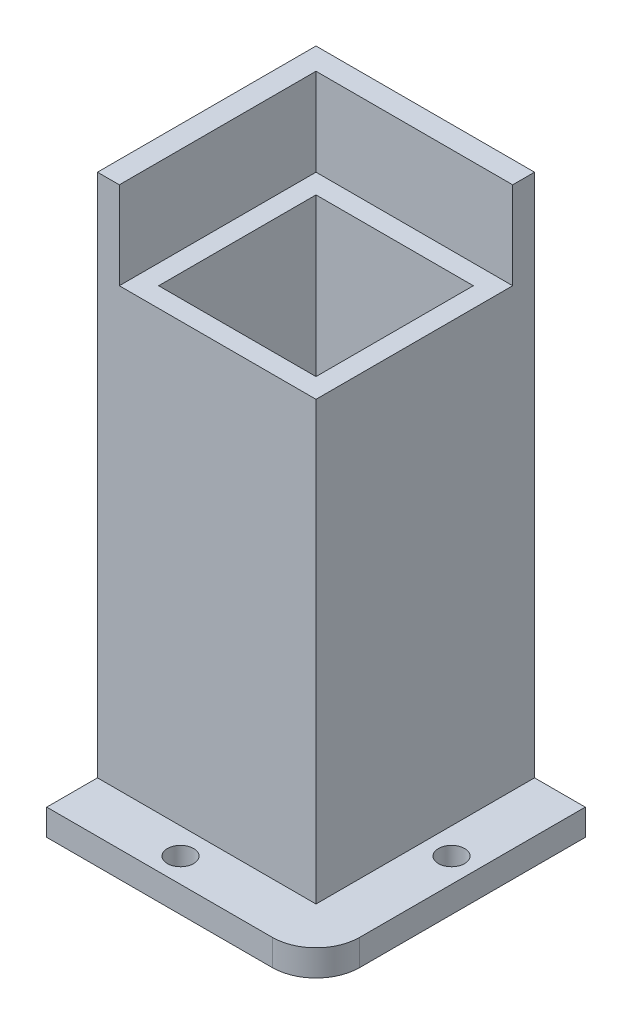
ISO-10303-21;
HEADER;
FILE_DESCRIPTION(('STEP AP214'),'2;1');
FILE_NAME('part.step','',(''),(''),'','','');
FILE_SCHEMA(('AUTOMOTIVE_DESIGN { 1 0 10303 214 1 1 1 1 }'));
ENDSEC;
DATA;
#1=APPLICATION_CONTEXT('core data for automotive mechanical design processes');
#2=APPLICATION_PROTOCOL_DEFINITION('international standard','automotive_design',2000,#1);
#3=PRODUCT_CONTEXT('',#1,'mechanical');
#4=PRODUCT('Part','Part','',(#3));
#5=PRODUCT_RELATED_PRODUCT_CATEGORY('part','',(#4));
#6=PRODUCT_DEFINITION_FORMATION('','',#4);
#7=PRODUCT_DEFINITION_CONTEXT('part definition',#1,'design');
#8=PRODUCT_DEFINITION('design','',#6,#7);
#9=PRODUCT_DEFINITION_SHAPE('','',#8);
#10=(LENGTH_UNIT() NAMED_UNIT(*) SI_UNIT(.MILLI.,.METRE.));
#11=(NAMED_UNIT(*) PLANE_ANGLE_UNIT() SI_UNIT($,.RADIAN.));
#12=(NAMED_UNIT(*) SI_UNIT($,.STERADIAN.) SOLID_ANGLE_UNIT());
#13=UNCERTAINTY_MEASURE_WITH_UNIT(LENGTH_MEASURE(1.E-05),#10,'distance_accuracy_value','');
#14=(GEOMETRIC_REPRESENTATION_CONTEXT(3) GLOBAL_UNCERTAINTY_ASSIGNED_CONTEXT((#13)) GLOBAL_UNIT_ASSIGNED_CONTEXT((#10,
#11,#12)) REPRESENTATION_CONTEXT('',''));
#15=CARTESIAN_POINT('',(0.,0.,0.));
#16=DIRECTION('',(0.,0.,1.));
#17=DIRECTION('',(1.,0.,0.));
#18=AXIS2_PLACEMENT_3D('',#15,#16,#17);
#19=CARTESIAN_POINT('',(12.5,63.,-12.5));
#20=DIRECTION('',(-1.,0.,0.));
#21=DIRECTION('',(0.,0.,1.));
#22=AXIS2_PLACEMENT_3D('',#19,#20,#21);
#23=PLANE('',#22);
#24=DIRECTION('',(0.,0.,1.));
#25=VECTOR('',#24,1.);
#26=CARTESIAN_POINT('',(12.5,3.,0.));
#27=LINE('',#26,#25);
#28=CARTESIAN_POINT('',(12.5,3.,-12.5));
#29=VERTEX_POINT('',#28);
#30=CARTESIAN_POINT('',(12.5,3.,12.5));
#31=VERTEX_POINT('',#30);
#32=EDGE_CURVE('E60',#29,#31,#27,.T.);
#33=ORIENTED_EDGE('',*,*,#32,.F.);
#34=DIRECTION('',(0.,-1.,0.));
#35=VECTOR('',#34,1.);
#36=CARTESIAN_POINT('',(12.5,63.,-12.5));
#37=LINE('',#36,#35);
#38=CARTESIAN_POINT('',(12.5,63.,-12.5));
#39=VERTEX_POINT('',#38);
#40=EDGE_CURVE('E11',#39,#29,#37,.T.);
#41=ORIENTED_EDGE('',*,*,#40,.F.);
#42=DIRECTION('',(0.,0.,-1.));
#43=VECTOR('',#42,1.);
#44=CARTESIAN_POINT('',(12.5,63.,-12.5));
#45=LINE('',#44,#43);
#46=CARTESIAN_POINT('',(12.5,63.,-9.99999999999998));
#47=VERTEX_POINT('',#46);
#48=EDGE_CURVE('E254',#47,#39,#45,.T.);
#49=ORIENTED_EDGE('',*,*,#48,.F.);
#50=DIRECTION('',(0.,1.,0.));
#51=VECTOR('',#50,1.);
#52=CARTESIAN_POINT('',(12.5,53.,-9.99999999999998));
#53=LINE('',#52,#51);
#54=CARTESIAN_POINT('',(12.5,53.,-9.99999999999998));
#55=VERTEX_POINT('',#54);
#56=EDGE_CURVE('E243',#55,#47,#53,.T.);
#57=ORIENTED_EDGE('',*,*,#56,.F.);
#58=DIRECTION('',(0.,0.,-1.));
#59=VECTOR('',#58,1.);
#60=CARTESIAN_POINT('',(12.5,53.,12.5));
#61=LINE('',#60,#59);
#62=CARTESIAN_POINT('',(12.5,53.,12.5));
#63=VERTEX_POINT('',#62);
#64=EDGE_CURVE('E231',#63,#55,#61,.T.);
#65=ORIENTED_EDGE('',*,*,#64,.F.);
#66=DIRECTION('',(0.,-1.,0.));
#67=VECTOR('',#66,1.);
#68=CARTESIAN_POINT('',(12.5,63.,12.5));
#69=LINE('',#68,#67);
#70=EDGE_CURVE('E264',#63,#31,#69,.T.);
#71=ORIENTED_EDGE('',*,*,#70,.T.);
#72=EDGE_LOOP('',(#33,#41,#49,#57,#65,#71));
#73=FACE_BOUND('',#72,.T.);
#74=ADVANCED_FACE('F38',(#73),#23,.F.);
#75=CARTESIAN_POINT('',(-12.5,63.,12.5));
#76=DIRECTION('',(0.,0.,-1.));
#77=DIRECTION('',(-1.,0.,0.));
#78=AXIS2_PLACEMENT_3D('',#75,#76,#77);
#79=PLANE('',#78);
#80=DIRECTION('',(-1.,0.,0.));
#81=VECTOR('',#80,1.);
#82=CARTESIAN_POINT('',(0.,3.,12.5));
#83=LINE('',#82,#81);
#84=CARTESIAN_POINT('',(-12.5,3.,12.5));
#85=VERTEX_POINT('',#84);
#86=EDGE_CURVE('E197',#31,#85,#83,.T.);
#87=ORIENTED_EDGE('',*,*,#86,.F.);
#88=ORIENTED_EDGE('',*,*,#70,.F.);
#89=DIRECTION('',(1.,0.,0.));
#90=VECTOR('',#89,1.);
#91=CARTESIAN_POINT('',(12.5,53.,12.5));
#92=LINE('',#91,#90);
#93=CARTESIAN_POINT('',(-9.99999999999998,53.,12.5));
#94=VERTEX_POINT('',#93);
#95=EDGE_CURVE('E241',#94,#63,#92,.T.);
#96=ORIENTED_EDGE('',*,*,#95,.F.);
#97=DIRECTION('',(0.,1.,0.));
#98=VECTOR('',#97,1.);
#99=CARTESIAN_POINT('',(-9.99999999999998,53.,12.5));
#100=LINE('',#99,#98);
#101=CARTESIAN_POINT('',(-9.99999999999998,63.,12.5));
#102=VERTEX_POINT('',#101);
#103=EDGE_CURVE('E247',#94,#102,#100,.T.);
#104=ORIENTED_EDGE('',*,*,#103,.T.);
#105=DIRECTION('',(1.,0.,0.));
#106=VECTOR('',#105,1.);
#107=CARTESIAN_POINT('',(-12.5,63.,12.5));
#108=LINE('',#107,#106);
#109=CARTESIAN_POINT('',(-12.5,63.,12.5));
#110=VERTEX_POINT('',#109);
#111=EDGE_CURVE('E261',#110,#102,#108,.T.);
#112=ORIENTED_EDGE('',*,*,#111,.F.);
#113=DIRECTION('',(0.,-1.,0.));
#114=VECTOR('',#113,1.);
#115=CARTESIAN_POINT('',(-12.5,63.,12.5));
#116=LINE('',#115,#114);
#117=EDGE_CURVE('E268',#110,#85,#116,.T.);
#118=ORIENTED_EDGE('',*,*,#117,.T.);
#119=EDGE_LOOP('',(#87,#88,#96,#104,#112,#118));
#120=FACE_BOUND('',#119,.T.);
#121=ADVANCED_FACE('F299',(#120),#79,.F.);
#122=CARTESIAN_POINT('',(-12.5,63.,-12.5));
#123=DIRECTION('',(0.,0.,1.));
#124=DIRECTION('',(1.,0.,0.));
#125=AXIS2_PLACEMENT_3D('',#122,#123,#124);
#126=PLANE('',#125);
#127=DIRECTION('',(-1.,0.,0.));
#128=VECTOR('',#127,1.);
#129=CARTESIAN_POINT('',(-12.5,0.,-12.5));
#130=LINE('',#129,#128);
#131=CARTESIAN_POINT('',(18.3,0.,-12.5));
#132=VERTEX_POINT('',#131);
#133=CARTESIAN_POINT('',(-12.5,0.,-12.5));
#134=VERTEX_POINT('',#133);
#135=EDGE_CURVE('E250',#132,#134,#130,.T.);
#136=ORIENTED_EDGE('',*,*,#135,.T.);
#137=DIRECTION('',(0.,-1.,0.));
#138=VECTOR('',#137,1.);
#139=CARTESIAN_POINT('',(-12.5,63.,-12.5));
#140=LINE('',#139,#138);
#141=CARTESIAN_POINT('',(-12.5,63.,-12.5));
#142=VERTEX_POINT('',#141);
#143=EDGE_CURVE('E45',#142,#134,#140,.T.);
#144=ORIENTED_EDGE('',*,*,#143,.F.);
#145=DIRECTION('',(-1.,0.,0.));
#146=VECTOR('',#145,1.);
#147=CARTESIAN_POINT('',(-12.5,63.,-12.5));
#148=LINE('',#147,#146);
#149=EDGE_CURVE('E256',#39,#142,#148,.T.);
#150=ORIENTED_EDGE('',*,*,#149,.F.);
#151=ORIENTED_EDGE('',*,*,#40,.T.);
#152=DIRECTION('',(1.,0.,0.));
#153=VECTOR('',#152,1.);
#154=CARTESIAN_POINT('',(0.,3.,-12.5));
#155=LINE('',#154,#153);
#156=CARTESIAN_POINT('',(18.3,3.,-12.5));
#157=VERTEX_POINT('',#156);
#158=EDGE_CURVE('E201',#29,#157,#155,.T.);
#159=ORIENTED_EDGE('',*,*,#158,.T.);
#160=DIRECTION('',(0.,-1.,0.));
#161=VECTOR('',#160,1.);
#162=CARTESIAN_POINT('',(18.3,3.,-12.5));
#163=LINE('',#162,#161);
#164=EDGE_CURVE('E223',#157,#132,#163,.T.);
#165=ORIENTED_EDGE('',*,*,#164,.T.);
#166=EDGE_LOOP('',(#136,#144,#150,#151,#159,#165));
#167=FACE_BOUND('',#166,.T.);
#168=ADVANCED_FACE('F306',(#167),#126,.F.);
#169=CARTESIAN_POINT('',(-12.5,63.,-12.5));
#170=DIRECTION('',(1.,0.,0.));
#171=DIRECTION('',(0.,0.,-1.));
#172=AXIS2_PLACEMENT_3D('',#169,#170,#171);
#173=PLANE('',#172);
#174=DIRECTION('',(0.,0.,1.));
#175=VECTOR('',#174,1.);
#176=CARTESIAN_POINT('',(-12.5,0.,-12.5));
#177=LINE('',#176,#175);
#178=CARTESIAN_POINT('',(-12.5,0.,18.3));
#179=VERTEX_POINT('',#178);
#180=EDGE_CURVE('E257',#134,#179,#177,.T.);
#181=ORIENTED_EDGE('',*,*,#180,.T.);
#182=DIRECTION('',(0.,-1.,0.));
#183=VECTOR('',#182,1.);
#184=CARTESIAN_POINT('',(-12.5,3.,18.3));
#185=LINE('',#184,#183);
#186=CARTESIAN_POINT('',(-12.5,3.,18.3));
#187=VERTEX_POINT('',#186);
#188=EDGE_CURVE('E226',#187,#179,#185,.T.);
#189=ORIENTED_EDGE('',*,*,#188,.F.);
#190=DIRECTION('',(0.,0.,1.));
#191=VECTOR('',#190,1.);
#192=CARTESIAN_POINT('',(-12.5,3.,0.));
#193=LINE('',#192,#191);
#194=EDGE_CURVE('E195',#85,#187,#193,.T.);
#195=ORIENTED_EDGE('',*,*,#194,.F.);
#196=ORIENTED_EDGE('',*,*,#117,.F.);
#197=DIRECTION('',(0.,0.,1.));
#198=VECTOR('',#197,1.);
#199=CARTESIAN_POINT('',(-12.5,63.,-12.5));
#200=LINE('',#199,#198);
#201=EDGE_CURVE('E259',#142,#110,#200,.T.);
#202=ORIENTED_EDGE('',*,*,#201,.F.);
#203=ORIENTED_EDGE('',*,*,#143,.T.);
#204=EDGE_LOOP('',(#181,#189,#195,#196,#202,#203));
#205=FACE_BOUND('',#204,.T.);
#206=ADVANCED_FACE('F274',(#205),#173,.F.);
#207=CARTESIAN_POINT('',(0.,63.,0.));
#208=DIRECTION('',(0.,1.,0.));
#209=DIRECTION('',(0.,0.,1.));
#210=AXIS2_PLACEMENT_3D('',#207,#208,#209);
#211=PLANE('',#210);
#212=DIRECTION('',(0.,0.,1.));
#213=VECTOR('',#212,1.);
#214=CARTESIAN_POINT('',(-9.99999999999998,63.,12.5));
#215=LINE('',#214,#213);
#216=CARTESIAN_POINT('',(-9.99999999999998,63.,-9.99999999999998));
#217=VERTEX_POINT('',#216);
#218=EDGE_CURVE('E235',#217,#102,#215,.T.);
#219=ORIENTED_EDGE('',*,*,#218,.F.);
#220=DIRECTION('',(-1.,0.,0.));
#221=VECTOR('',#220,1.);
#222=CARTESIAN_POINT('',(12.5,63.,-9.99999999999998));
#223=LINE('',#222,#221);
#224=EDGE_CURVE('E222',#47,#217,#223,.T.);
#225=ORIENTED_EDGE('',*,*,#224,.F.);
#226=ORIENTED_EDGE('',*,*,#48,.T.);
#227=ORIENTED_EDGE('',*,*,#149,.T.);
#228=ORIENTED_EDGE('',*,*,#201,.T.);
#229=ORIENTED_EDGE('',*,*,#111,.T.);
#230=EDGE_LOOP('',(#219,#225,#226,#227,#228,#229));
#231=FACE_BOUND('',#230,.T.);
#232=ADVANCED_FACE('F303',(#231),#211,.T.);
#233=CARTESIAN_POINT('',(0.,0.,0.));
#234=DIRECTION('',(0.,1.,0.));
#235=DIRECTION('',(0.,0.,1.));
#236=AXIS2_PLACEMENT_3D('',#233,#234,#235);
#237=PLANE('',#236);
#238=ORIENTED_EDGE('',*,*,#135,.F.);
#239=DIRECTION('',(0.,0.,1.));
#240=VECTOR('',#239,1.);
#241=CARTESIAN_POINT('',(18.3,0.,0.));
#242=LINE('',#241,#240);
#243=CARTESIAN_POINT('',(18.3,0.,13.3));
#244=VERTEX_POINT('',#243);
#245=EDGE_CURVE('E188',#132,#244,#242,.T.);
#246=ORIENTED_EDGE('',*,*,#245,.T.);
#247=CARTESIAN_POINT('',(13.3,0.,13.3));
#248=DIRECTION('',(0.,-1.,0.));
#249=DIRECTION('',(0.,0.,-1.));
#250=AXIS2_PLACEMENT_3D('',#247,#248,#249);
#251=CIRCLE('',#250,5.);
#252=CARTESIAN_POINT('',(13.3,0.,18.3));
#253=VERTEX_POINT('',#252);
#254=EDGE_CURVE('E213',#253,#244,#251,.F.);
#255=ORIENTED_EDGE('',*,*,#254,.F.);
#256=DIRECTION('',(1.,0.,0.));
#257=VECTOR('',#256,1.);
#258=CARTESIAN_POINT('',(0.,0.,18.3));
#259=LINE('',#258,#257);
#260=EDGE_CURVE('E216',#179,#253,#259,.T.);
#261=ORIENTED_EDGE('',*,*,#260,.F.);
#262=ORIENTED_EDGE('',*,*,#180,.F.);
#263=EDGE_LOOP('',(#238,#246,#255,#261,#262));
#264=FACE_BOUND('',#263,.T.);
#265=CARTESIAN_POINT('',(15.5,0.,0.));
#266=DIRECTION('',(0.,-1.,0.));
#267=DIRECTION('',(0.,0.,-1.));
#268=AXIS2_PLACEMENT_3D('',#265,#266,#267);
#269=CIRCLE('',#268,1.5);
#270=CARTESIAN_POINT('',(15.5,0.,-1.49999999999998));
#271=VERTEX_POINT('',#270);
#272=EDGE_CURVE('E180',#271,#271,#269,.T.);
#273=ORIENTED_EDGE('',*,*,#272,.F.);
#274=EDGE_LOOP('',(#273));
#275=FACE_BOUND('',#274,.T.);
#276=CARTESIAN_POINT('',(0.,0.,15.5));
#277=DIRECTION('',(0.,-1.,0.));
#278=DIRECTION('',(0.,0.,-1.));
#279=AXIS2_PLACEMENT_3D('',#276,#277,#278);
#280=CIRCLE('',#279,1.5);
#281=CARTESIAN_POINT('',(0.,0.,14.));
#282=VERTEX_POINT('',#281);
#283=EDGE_CURVE('E210',#282,#282,#280,.T.);
#284=ORIENTED_EDGE('',*,*,#283,.F.);
#285=EDGE_LOOP('',(#284));
#286=FACE_BOUND('',#285,.T.);
#287=ADVANCED_FACE('F281',(#264,#275,#286),#237,.F.);
#288=CARTESIAN_POINT('',(-9.99999999999998,53.,12.5));
#289=DIRECTION('',(-1.,0.,0.));
#290=DIRECTION('',(0.,0.,1.));
#291=AXIS2_PLACEMENT_3D('',#288,#289,#290);
#292=PLANE('',#291);
#293=ORIENTED_EDGE('',*,*,#218,.T.);
#294=ORIENTED_EDGE('',*,*,#103,.F.);
#295=DIRECTION('',(0.,0.,1.));
#296=VECTOR('',#295,1.);
#297=CARTESIAN_POINT('',(-9.99999999999998,53.,12.5));
#298=LINE('',#297,#296);
#299=CARTESIAN_POINT('',(-9.99999999999998,53.,-9.99999999999998));
#300=VERTEX_POINT('',#299);
#301=EDGE_CURVE('E238',#300,#94,#298,.T.);
#302=ORIENTED_EDGE('',*,*,#301,.F.);
#303=DIRECTION('',(0.,1.,0.));
#304=VECTOR('',#303,1.);
#305=CARTESIAN_POINT('',(-9.99999999999998,53.,-9.99999999999998));
#306=LINE('',#305,#304);
#307=EDGE_CURVE('E251',#300,#217,#306,.T.);
#308=ORIENTED_EDGE('',*,*,#307,.T.);
#309=EDGE_LOOP('',(#293,#294,#302,#308));
#310=FACE_BOUND('',#309,.T.);
#311=ADVANCED_FACE('F349',(#310),#292,.F.);
#312=CARTESIAN_POINT('',(12.5,53.,-9.99999999999998));
#313=DIRECTION('',(0.,0.,-1.));
#314=DIRECTION('',(-1.,0.,0.));
#315=AXIS2_PLACEMENT_3D('',#312,#313,#314);
#316=PLANE('',#315);
#317=ORIENTED_EDGE('',*,*,#224,.T.);
#318=ORIENTED_EDGE('',*,*,#307,.F.);
#319=DIRECTION('',(-1.,0.,0.));
#320=VECTOR('',#319,1.);
#321=CARTESIAN_POINT('',(12.5,53.,-9.99999999999998));
#322=LINE('',#321,#320);
#323=EDGE_CURVE('E234',#55,#300,#322,.T.);
#324=ORIENTED_EDGE('',*,*,#323,.F.);
#325=ORIENTED_EDGE('',*,*,#56,.T.);
#326=EDGE_LOOP('',(#317,#318,#324,#325));
#327=FACE_BOUND('',#326,.T.);
#328=ADVANCED_FACE('F311',(#327),#316,.F.);
#329=CARTESIAN_POINT('',(0.,53.,0.));
#330=DIRECTION('',(0.,1.,0.));
#331=DIRECTION('',(0.,0.,1.));
#332=AXIS2_PLACEMENT_3D('',#329,#330,#331);
#333=PLANE('',#332);
#334=DIRECTION('',(0.,0.,-1.));
#335=VECTOR('',#334,1.);
#336=CARTESIAN_POINT('',(10.25,53.,-7.74999999999998));
#337=LINE('',#336,#335);
#338=CARTESIAN_POINT('',(10.25,53.,10.25));
#339=VERTEX_POINT('',#338);
#340=CARTESIAN_POINT('',(10.25,53.,-7.74999999999998));
#341=VERTEX_POINT('',#340);
#342=EDGE_CURVE('E52',#339,#341,#337,.T.);
#343=ORIENTED_EDGE('',*,*,#342,.F.);
#344=DIRECTION('',(1.,0.,0.));
#345=VECTOR('',#344,1.);
#346=CARTESIAN_POINT('',(-7.74999999999998,53.,10.25));
#347=LINE('',#346,#345);
#348=CARTESIAN_POINT('',(-7.74999999999998,53.,10.25));
#349=VERTEX_POINT('',#348);
#350=EDGE_CURVE('E165',#349,#339,#347,.T.);
#351=ORIENTED_EDGE('',*,*,#350,.F.);
#352=DIRECTION('',(0.,0.,1.));
#353=VECTOR('',#352,1.);
#354=CARTESIAN_POINT('',(-7.74999999999998,53.,-7.74999999999998));
#355=LINE('',#354,#353);
#356=CARTESIAN_POINT('',(-7.74999999999998,53.,-7.74999999999998));
#357=VERTEX_POINT('',#356);
#358=EDGE_CURVE('E168',#357,#349,#355,.T.);
#359=ORIENTED_EDGE('',*,*,#358,.F.);
#360=DIRECTION('',(-1.,0.,0.));
#361=VECTOR('',#360,1.);
#362=CARTESIAN_POINT('',(-7.74999999999998,53.,-7.74999999999998));
#363=LINE('',#362,#361);
#364=EDGE_CURVE('E174',#341,#357,#363,.T.);
#365=ORIENTED_EDGE('',*,*,#364,.F.);
#366=EDGE_LOOP('',(#343,#351,#359,#365));
#367=FACE_BOUND('',#366,.T.);
#368=ORIENTED_EDGE('',*,*,#64,.T.);
#369=ORIENTED_EDGE('',*,*,#323,.T.);
#370=ORIENTED_EDGE('',*,*,#301,.T.);
#371=ORIENTED_EDGE('',*,*,#95,.T.);
#372=EDGE_LOOP('',(#368,#369,#370,#371));
#373=FACE_BOUND('',#372,.T.);
#374=ADVANCED_FACE('F314',(#367,#373),#333,.T.);
#375=CARTESIAN_POINT('',(13.3,3.,13.3));
#376=DIRECTION('',(0.,-1.,0.));
#377=DIRECTION('',(0.,0.,-1.));
#378=AXIS2_PLACEMENT_3D('',#375,#376,#377);
#379=CYLINDRICAL_SURFACE('',#378,5.);
#380=ORIENTED_EDGE('',*,*,#254,.T.);
#381=DIRECTION('',(0.,-1.,0.));
#382=VECTOR('',#381,1.);
#383=CARTESIAN_POINT('',(18.3,3.,13.3));
#384=LINE('',#383,#382);
#385=CARTESIAN_POINT('',(18.3,3.,13.3));
#386=VERTEX_POINT('',#385);
#387=EDGE_CURVE('E220',#386,#244,#384,.T.);
#388=ORIENTED_EDGE('',*,*,#387,.F.);
#389=CARTESIAN_POINT('',(13.3,3.,13.3));
#390=DIRECTION('',(0.,-1.,0.));
#391=DIRECTION('',(0.,0.,-1.));
#392=AXIS2_PLACEMENT_3D('',#389,#390,#391);
#393=CIRCLE('',#392,5.);
#394=CARTESIAN_POINT('',(13.3,3.,18.3));
#395=VERTEX_POINT('',#394);
#396=EDGE_CURVE('E191',#395,#386,#393,.F.);
#397=ORIENTED_EDGE('',*,*,#396,.F.);
#398=DIRECTION('',(0.,-1.,0.));
#399=VECTOR('',#398,1.);
#400=CARTESIAN_POINT('',(13.3,3.,18.3));
#401=LINE('',#400,#399);
#402=EDGE_CURVE('E207',#395,#253,#401,.T.);
#403=ORIENTED_EDGE('',*,*,#402,.T.);
#404=EDGE_LOOP('',(#380,#388,#397,#403));
#405=FACE_BOUND('',#404,.T.);
#406=ADVANCED_FACE('F290',(#405),#379,.T.);
#407=CARTESIAN_POINT('',(18.3,3.,0.));
#408=DIRECTION('',(1.,0.,0.));
#409=DIRECTION('',(0.,0.,-1.));
#410=AXIS2_PLACEMENT_3D('',#407,#408,#409);
#411=PLANE('',#410);
#412=ORIENTED_EDGE('',*,*,#245,.F.);
#413=ORIENTED_EDGE('',*,*,#164,.F.);
#414=DIRECTION('',(0.,0.,1.));
#415=VECTOR('',#414,1.);
#416=CARTESIAN_POINT('',(18.3,3.,0.));
#417=LINE('',#416,#415);
#418=EDGE_CURVE('E204',#157,#386,#417,.T.);
#419=ORIENTED_EDGE('',*,*,#418,.T.);
#420=ORIENTED_EDGE('',*,*,#387,.T.);
#421=EDGE_LOOP('',(#412,#413,#419,#420));
#422=FACE_BOUND('',#421,.T.);
#423=ADVANCED_FACE('F317',(#422),#411,.T.);
#424=CARTESIAN_POINT('',(0.,3.,15.5));
#425=DIRECTION('',(0.,-1.,0.));
#426=DIRECTION('',(0.,0.,-1.));
#427=AXIS2_PLACEMENT_3D('',#424,#425,#426);
#428=CYLINDRICAL_SURFACE('',#427,1.5);
#429=CARTESIAN_POINT('',(0.,3.,15.5));
#430=DIRECTION('',(0.,-1.,0.));
#431=DIRECTION('',(0.,0.,-1.));
#432=AXIS2_PLACEMENT_3D('',#429,#430,#431);
#433=CIRCLE('',#432,1.5);
#434=CARTESIAN_POINT('',(0.,3.,14.));
#435=VERTEX_POINT('',#434);
#436=EDGE_CURVE('E187',#435,#435,#433,.T.);
#437=ORIENTED_EDGE('',*,*,#436,.F.);
#438=EDGE_LOOP('',(#437));
#439=FACE_BOUND('',#438,.T.);
#440=ORIENTED_EDGE('',*,*,#283,.T.);
#441=EDGE_LOOP('',(#440));
#442=FACE_BOUND('',#441,.T.);
#443=ADVANCED_FACE('F319',(#439,#442),#428,.F.);
#444=CARTESIAN_POINT('',(15.5,3.,0.));
#445=DIRECTION('',(0.,-1.,0.));
#446=DIRECTION('',(0.,0.,-1.));
#447=AXIS2_PLACEMENT_3D('',#444,#445,#446);
#448=CYLINDRICAL_SURFACE('',#447,1.5);
#449=CARTESIAN_POINT('',(15.5,3.,0.));
#450=DIRECTION('',(0.,-1.,0.));
#451=DIRECTION('',(0.,0.,-1.));
#452=AXIS2_PLACEMENT_3D('',#449,#450,#451);
#453=CIRCLE('',#452,1.5);
#454=CARTESIAN_POINT('',(15.5,3.,-1.49999999999998));
#455=VERTEX_POINT('',#454);
#456=EDGE_CURVE('E184',#455,#455,#453,.T.);
#457=ORIENTED_EDGE('',*,*,#456,.F.);
#458=EDGE_LOOP('',(#457));
#459=FACE_BOUND('',#458,.T.);
#460=ORIENTED_EDGE('',*,*,#272,.T.);
#461=EDGE_LOOP('',(#460));
#462=FACE_BOUND('',#461,.T.);
#463=ADVANCED_FACE('F325',(#459,#462),#448,.F.);
#464=CARTESIAN_POINT('',(0.,3.,18.3));
#465=DIRECTION('',(0.,0.,-1.));
#466=DIRECTION('',(-1.,0.,0.));
#467=AXIS2_PLACEMENT_3D('',#464,#465,#466);
#468=PLANE('',#467);
#469=ORIENTED_EDGE('',*,*,#260,.T.);
#470=ORIENTED_EDGE('',*,*,#402,.F.);
#471=DIRECTION('',(1.,0.,0.));
#472=VECTOR('',#471,1.);
#473=CARTESIAN_POINT('',(0.,3.,18.3));
#474=LINE('',#473,#472);
#475=EDGE_CURVE('E193',#187,#395,#474,.T.);
#476=ORIENTED_EDGE('',*,*,#475,.F.);
#477=ORIENTED_EDGE('',*,*,#188,.T.);
#478=EDGE_LOOP('',(#469,#470,#476,#477));
#479=FACE_BOUND('',#478,.T.);
#480=ADVANCED_FACE('F286',(#479),#468,.F.);
#481=CARTESIAN_POINT('',(0.,3.,0.));
#482=DIRECTION('',(0.,-1.,0.));
#483=DIRECTION('',(0.,0.,-1.));
#484=AXIS2_PLACEMENT_3D('',#481,#482,#483);
#485=PLANE('',#484);
#486=ORIENTED_EDGE('',*,*,#456,.T.);
#487=EDGE_LOOP('',(#486));
#488=FACE_BOUND('',#487,.T.);
#489=ORIENTED_EDGE('',*,*,#436,.T.);
#490=EDGE_LOOP('',(#489));
#491=FACE_BOUND('',#490,.T.);
#492=ORIENTED_EDGE('',*,*,#396,.T.);
#493=ORIENTED_EDGE('',*,*,#418,.F.);
#494=ORIENTED_EDGE('',*,*,#158,.F.);
#495=ORIENTED_EDGE('',*,*,#32,.T.);
#496=ORIENTED_EDGE('',*,*,#86,.T.);
#497=ORIENTED_EDGE('',*,*,#194,.T.);
#498=ORIENTED_EDGE('',*,*,#475,.T.);
#499=EDGE_LOOP('',(#492,#493,#494,#495,#496,#497,#498));
#500=FACE_BOUND('',#499,.T.);
#501=ADVANCED_FACE('F294',(#488,#491,#500),#485,.F.);
#502=CARTESIAN_POINT('',(10.25,3.,-7.74999999999998));
#503=DIRECTION('',(1.,0.,0.));
#504=DIRECTION('',(0.,0.,-1.));
#505=AXIS2_PLACEMENT_3D('',#502,#503,#504);
#506=PLANE('',#505);
#507=ORIENTED_EDGE('',*,*,#342,.T.);
#508=DIRECTION('',(0.,1.,0.));
#509=VECTOR('',#508,1.);
#510=CARTESIAN_POINT('',(10.25,3.,-7.74999999999998));
#511=LINE('',#510,#509);
#512=CARTESIAN_POINT('',(10.25,3.,-7.74999999999998));
#513=VERTEX_POINT('',#512);
#514=EDGE_CURVE('E143',#513,#341,#511,.T.);
#515=ORIENTED_EDGE('',*,*,#514,.F.);
#516=DIRECTION('',(0.,0.,-1.));
#517=VECTOR('',#516,1.);
#518=CARTESIAN_POINT('',(10.25,3.,-7.74999999999998));
#519=LINE('',#518,#517);
#520=CARTESIAN_POINT('',(10.25,3.,10.25));
#521=VERTEX_POINT('',#520);
#522=EDGE_CURVE('E147',#521,#513,#519,.T.);
#523=ORIENTED_EDGE('',*,*,#522,.F.);
#524=DIRECTION('',(0.,1.,0.));
#525=VECTOR('',#524,1.);
#526=CARTESIAN_POINT('',(10.25,3.,10.25));
#527=LINE('',#526,#525);
#528=EDGE_CURVE('E178',#521,#339,#527,.T.);
#529=ORIENTED_EDGE('',*,*,#528,.T.);
#530=EDGE_LOOP('',(#507,#515,#523,#529));
#531=FACE_BOUND('',#530,.T.);
#532=ADVANCED_FACE('F145',(#531),#506,.F.);
#533=CARTESIAN_POINT('',(-7.74999999999998,3.,10.25));
#534=DIRECTION('',(0.,0.,1.));
#535=DIRECTION('',(1.,0.,0.));
#536=AXIS2_PLACEMENT_3D('',#533,#534,#535);
#537=PLANE('',#536);
#538=ORIENTED_EDGE('',*,*,#350,.T.);
#539=ORIENTED_EDGE('',*,*,#528,.F.);
#540=DIRECTION('',(1.,0.,0.));
#541=VECTOR('',#540,1.);
#542=CARTESIAN_POINT('',(-7.74999999999998,3.,10.25));
#543=LINE('',#542,#541);
#544=CARTESIAN_POINT('',(-7.74999999999998,3.,10.25));
#545=VERTEX_POINT('',#544);
#546=EDGE_CURVE('E153',#545,#521,#543,.T.);
#547=ORIENTED_EDGE('',*,*,#546,.F.);
#548=DIRECTION('',(0.,1.,0.));
#549=VECTOR('',#548,1.);
#550=CARTESIAN_POINT('',(-7.74999999999998,3.,10.25));
#551=LINE('',#550,#549);
#552=EDGE_CURVE('E181',#545,#349,#551,.T.);
#553=ORIENTED_EDGE('',*,*,#552,.T.);
#554=EDGE_LOOP('',(#538,#539,#547,#553));
#555=FACE_BOUND('',#554,.T.);
#556=ADVANCED_FACE('F369',(#555),#537,.F.);
#557=CARTESIAN_POINT('',(-7.74999999999998,3.,-7.74999999999998));
#558=DIRECTION('',(-1.,0.,0.));
#559=DIRECTION('',(0.,0.,1.));
#560=AXIS2_PLACEMENT_3D('',#557,#558,#559);
#561=PLANE('',#560);
#562=ORIENTED_EDGE('',*,*,#358,.T.);
#563=ORIENTED_EDGE('',*,*,#552,.F.);
#564=DIRECTION('',(0.,0.,1.));
#565=VECTOR('',#564,1.);
#566=CARTESIAN_POINT('',(-7.74999999999998,3.,-7.74999999999998));
#567=LINE('',#566,#565);
#568=CARTESIAN_POINT('',(-7.74999999999998,3.,-7.74999999999998));
#569=VERTEX_POINT('',#568);
#570=EDGE_CURVE('E161',#569,#545,#567,.T.);
#571=ORIENTED_EDGE('',*,*,#570,.F.);
#572=DIRECTION('',(0.,1.,0.));
#573=VECTOR('',#572,1.);
#574=CARTESIAN_POINT('',(-7.74999999999998,3.,-7.74999999999998));
#575=LINE('',#574,#573);
#576=EDGE_CURVE('E152',#569,#357,#575,.T.);
#577=ORIENTED_EDGE('',*,*,#576,.T.);
#578=EDGE_LOOP('',(#562,#563,#571,#577));
#579=FACE_BOUND('',#578,.T.);
#580=ADVANCED_FACE('F375',(#579),#561,.F.);
#581=CARTESIAN_POINT('',(-7.74999999999998,3.,-7.74999999999998));
#582=DIRECTION('',(0.,0.,-1.));
#583=DIRECTION('',(-1.,0.,0.));
#584=AXIS2_PLACEMENT_3D('',#581,#582,#583);
#585=PLANE('',#584);
#586=ORIENTED_EDGE('',*,*,#364,.T.);
#587=ORIENTED_EDGE('',*,*,#576,.F.);
#588=DIRECTION('',(-1.,0.,0.));
#589=VECTOR('',#588,1.);
#590=CARTESIAN_POINT('',(-7.74999999999998,3.,-7.74999999999998));
#591=LINE('',#590,#589);
#592=EDGE_CURVE('E156',#513,#569,#591,.T.);
#593=ORIENTED_EDGE('',*,*,#592,.F.);
#594=ORIENTED_EDGE('',*,*,#514,.T.);
#595=EDGE_LOOP('',(#586,#587,#593,#594));
#596=FACE_BOUND('',#595,.T.);
#597=ADVANCED_FACE('F157',(#596),#585,.F.);
#598=CARTESIAN_POINT('',(0.,3.,0.));
#599=DIRECTION('',(0.,1.,0.));
#600=DIRECTION('',(0.,0.,1.));
#601=AXIS2_PLACEMENT_3D('',#598,#599,#600);
#602=PLANE('',#601);
#603=ORIENTED_EDGE('',*,*,#522,.T.);
#604=ORIENTED_EDGE('',*,*,#592,.T.);
#605=ORIENTED_EDGE('',*,*,#570,.T.);
#606=ORIENTED_EDGE('',*,*,#546,.T.);
#607=EDGE_LOOP('',(#603,#604,#605,#606));
#608=FACE_BOUND('',#607,.T.);
#609=ADVANCED_FACE('F163',(#608),#602,.T.);
#610=CLOSED_SHELL('',(#74,#121,#168,#206,#232,#287,#311,#328,#374,#406,#423,#443,#463,#480,#501,
#532,#556,#580,#597,#609));
#611=MANIFOLD_SOLID_BREP('B2',#610);
#612=ADVANCED_BREP_SHAPE_REPRESENTATION('',(#18,#611),#14);
#613=SHAPE_DEFINITION_REPRESENTATION(#9,#612);
ENDSEC;
END-ISO-10303-21;
